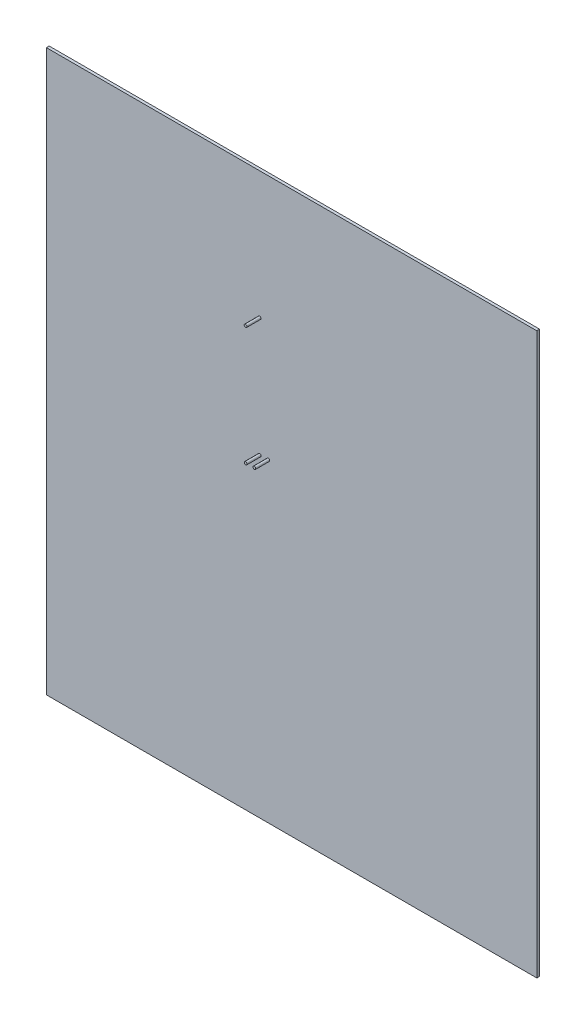
ISO-10303-21;
HEADER;
FILE_DESCRIPTION(('STEP AP214'),'2;1');
FILE_NAME('part.step','',(''),(''),'','','');
FILE_SCHEMA(('AUTOMOTIVE_DESIGN { 1 0 10303 214 1 1 1 1 }'));
ENDSEC;
DATA;
#1=APPLICATION_CONTEXT('core data for automotive mechanical design processes');
#2=APPLICATION_PROTOCOL_DEFINITION('international standard','automotive_design',2000,#1);
#3=PRODUCT_CONTEXT('',#1,'mechanical');
#4=PRODUCT('Part','Part','',(#3));
#5=PRODUCT_RELATED_PRODUCT_CATEGORY('part','',(#4));
#6=PRODUCT_DEFINITION_FORMATION('','',#4);
#7=PRODUCT_DEFINITION_CONTEXT('part definition',#1,'design');
#8=PRODUCT_DEFINITION('design','',#6,#7);
#9=PRODUCT_DEFINITION_SHAPE('','',#8);
#10=(LENGTH_UNIT() NAMED_UNIT(*) SI_UNIT(.MILLI.,.METRE.));
#11=(NAMED_UNIT(*) PLANE_ANGLE_UNIT() SI_UNIT($,.RADIAN.));
#12=(NAMED_UNIT(*) SI_UNIT($,.STERADIAN.) SOLID_ANGLE_UNIT());
#13=UNCERTAINTY_MEASURE_WITH_UNIT(LENGTH_MEASURE(1.E-05),#10,'distance_accuracy_value','');
#14=(GEOMETRIC_REPRESENTATION_CONTEXT(3) GLOBAL_UNCERTAINTY_ASSIGNED_CONTEXT((#13)) GLOBAL_UNIT_ASSIGNED_CONTEXT((#10,
#11,#12)) REPRESENTATION_CONTEXT('',''));
#15=CARTESIAN_POINT('',(0.,0.,0.));
#16=DIRECTION('',(0.,0.,1.));
#17=DIRECTION('',(1.,0.,0.));
#18=AXIS2_PLACEMENT_3D('',#15,#16,#17);
#19=CARTESIAN_POINT('',(175.,-200.,2.));
#20=DIRECTION('',(-1.,0.,0.));
#21=DIRECTION('',(0.,0.,1.));
#22=AXIS2_PLACEMENT_3D('',#19,#20,#21);
#23=PLANE('',#22);
#24=DIRECTION('',(0.,1.,0.));
#25=VECTOR('',#24,1.);
#26=CARTESIAN_POINT('',(175.,-200.,0.));
#27=LINE('',#26,#25);
#28=CARTESIAN_POINT('',(175.,-200.,0.));
#29=VERTEX_POINT('',#28);
#30=CARTESIAN_POINT('',(175.,200.,0.));
#31=VERTEX_POINT('',#30);
#32=EDGE_CURVE('E108',#29,#31,#27,.T.);
#33=ORIENTED_EDGE('',*,*,#32,.T.);
#34=DIRECTION('',(0.,0.,-1.));
#35=VECTOR('',#34,1.);
#36=CARTESIAN_POINT('',(175.,200.,2.));
#37=LINE('',#36,#35);
#38=CARTESIAN_POINT('',(175.,200.,2.));
#39=VERTEX_POINT('',#38);
#40=EDGE_CURVE('E99',#39,#31,#37,.T.);
#41=ORIENTED_EDGE('',*,*,#40,.F.);
#42=DIRECTION('',(0.,1.,0.));
#43=VECTOR('',#42,1.);
#44=CARTESIAN_POINT('',(175.,-200.,2.));
#45=LINE('',#44,#43);
#46=CARTESIAN_POINT('',(175.,-200.,2.));
#47=VERTEX_POINT('',#46);
#48=EDGE_CURVE('E93',#47,#39,#45,.T.);
#49=ORIENTED_EDGE('',*,*,#48,.F.);
#50=DIRECTION('',(0.,0.,-1.));
#51=VECTOR('',#50,1.);
#52=CARTESIAN_POINT('',(175.,-200.,2.));
#53=LINE('',#52,#51);
#54=EDGE_CURVE('E104',#47,#29,#53,.T.);
#55=ORIENTED_EDGE('',*,*,#54,.T.);
#56=EDGE_LOOP('',(#33,#41,#49,#55));
#57=FACE_BOUND('',#56,.T.);
#58=ADVANCED_FACE('F41',(#57),#23,.F.);
#59=CARTESIAN_POINT('',(-175.,200.,2.));
#60=DIRECTION('',(0.,-1.,0.));
#61=DIRECTION('',(0.,0.,-1.));
#62=AXIS2_PLACEMENT_3D('',#59,#60,#61);
#63=PLANE('',#62);
#64=DIRECTION('',(-1.,0.,0.));
#65=VECTOR('',#64,1.);
#66=CARTESIAN_POINT('',(-175.,200.,0.));
#67=LINE('',#66,#65);
#68=CARTESIAN_POINT('',(-175.,200.,0.));
#69=VERTEX_POINT('',#68);
#70=EDGE_CURVE('E98',#31,#69,#67,.T.);
#71=ORIENTED_EDGE('',*,*,#70,.T.);
#72=DIRECTION('',(0.,0.,-1.));
#73=VECTOR('',#72,1.);
#74=CARTESIAN_POINT('',(-175.,200.,2.));
#75=LINE('',#74,#73);
#76=CARTESIAN_POINT('',(-175.,200.,2.));
#77=VERTEX_POINT('',#76);
#78=EDGE_CURVE('E96',#77,#69,#75,.T.);
#79=ORIENTED_EDGE('',*,*,#78,.F.);
#80=DIRECTION('',(-1.,0.,0.));
#81=VECTOR('',#80,1.);
#82=CARTESIAN_POINT('',(-175.,200.,2.));
#83=LINE('',#82,#81);
#84=EDGE_CURVE('E88',#39,#77,#83,.T.);
#85=ORIENTED_EDGE('',*,*,#84,.F.);
#86=ORIENTED_EDGE('',*,*,#40,.T.);
#87=EDGE_LOOP('',(#71,#79,#85,#86));
#88=FACE_BOUND('',#87,.T.);
#89=ADVANCED_FACE('F97',(#88),#63,.F.);
#90=CARTESIAN_POINT('',(-175.,-200.,2.));
#91=DIRECTION('',(1.,0.,0.));
#92=DIRECTION('',(0.,0.,-1.));
#93=AXIS2_PLACEMENT_3D('',#90,#91,#92);
#94=PLANE('',#93);
#95=DIRECTION('',(0.,-1.,0.));
#96=VECTOR('',#95,1.);
#97=CARTESIAN_POINT('',(-175.,-200.,0.));
#98=LINE('',#97,#96);
#99=CARTESIAN_POINT('',(-175.,-200.,0.));
#100=VERTEX_POINT('',#99);
#101=EDGE_CURVE('E74',#69,#100,#98,.T.);
#102=ORIENTED_EDGE('',*,*,#101,.T.);
#103=DIRECTION('',(0.,0.,-1.));
#104=VECTOR('',#103,1.);
#105=CARTESIAN_POINT('',(-175.,-200.,2.));
#106=LINE('',#105,#104);
#107=CARTESIAN_POINT('',(-175.,-200.,2.));
#108=VERTEX_POINT('',#107);
#109=EDGE_CURVE('E100',#108,#100,#106,.T.);
#110=ORIENTED_EDGE('',*,*,#109,.F.);
#111=DIRECTION('',(0.,-1.,0.));
#112=VECTOR('',#111,1.);
#113=CARTESIAN_POINT('',(-175.,-200.,2.));
#114=LINE('',#113,#112);
#115=EDGE_CURVE('E91',#77,#108,#114,.T.);
#116=ORIENTED_EDGE('',*,*,#115,.F.);
#117=ORIENTED_EDGE('',*,*,#78,.T.);
#118=EDGE_LOOP('',(#102,#110,#116,#117));
#119=FACE_BOUND('',#118,.T.);
#120=ADVANCED_FACE('F102',(#119),#94,.F.);
#121=CARTESIAN_POINT('',(-175.,-200.,2.));
#122=DIRECTION('',(0.,1.,0.));
#123=DIRECTION('',(0.,0.,1.));
#124=AXIS2_PLACEMENT_3D('',#121,#122,#123);
#125=PLANE('',#124);
#126=DIRECTION('',(1.,0.,0.));
#127=VECTOR('',#126,1.);
#128=CARTESIAN_POINT('',(-175.,-200.,0.));
#129=LINE('',#128,#127);
#130=EDGE_CURVE('E80',#100,#29,#129,.T.);
#131=ORIENTED_EDGE('',*,*,#130,.T.);
#132=ORIENTED_EDGE('',*,*,#54,.F.);
#133=DIRECTION('',(1.,0.,0.));
#134=VECTOR('',#133,1.);
#135=CARTESIAN_POINT('',(-175.,-200.,2.));
#136=LINE('',#135,#134);
#137=EDGE_CURVE('E57',#108,#47,#136,.T.);
#138=ORIENTED_EDGE('',*,*,#137,.F.);
#139=ORIENTED_EDGE('',*,*,#109,.T.);
#140=EDGE_LOOP('',(#131,#132,#138,#139));
#141=FACE_BOUND('',#140,.T.);
#142=ADVANCED_FACE('F128',(#141),#125,.F.);
#143=CARTESIAN_POINT('',(0.,0.,2.));
#144=DIRECTION('',(0.,0.,-1.));
#145=DIRECTION('',(-1.,0.,0.));
#146=AXIS2_PLACEMENT_3D('',#143,#144,#145);
#147=PLANE('',#146);
#148=CARTESIAN_POINT('',(-22.83,109.16,2.));
#149=DIRECTION('',(0.,0.,-1.));
#150=DIRECTION('',(-1.,0.,0.));
#151=AXIS2_PLACEMENT_3D('',#148,#149,#150);
#152=CIRCLE('',#151,1.);
#153=CARTESIAN_POINT('',(-23.83,109.16,2.));
#154=VERTEX_POINT('',#153);
#155=EDGE_CURVE('E11',#154,#154,#152,.F.);
#156=ORIENTED_EDGE('',*,*,#155,.F.);
#157=EDGE_LOOP('',(#156));
#158=FACE_BOUND('',#157,.T.);
#159=CARTESIAN_POINT('',(-22.7700000000001,24.27,2.));
#160=DIRECTION('',(0.,0.,-1.));
#161=DIRECTION('',(-1.,0.,0.));
#162=AXIS2_PLACEMENT_3D('',#159,#160,#161);
#163=CIRCLE('',#162,1.);
#164=CARTESIAN_POINT('',(-23.7700000000001,24.27,2.));
#165=VERTEX_POINT('',#164);
#166=EDGE_CURVE('E49',#165,#165,#163,.F.);
#167=ORIENTED_EDGE('',*,*,#166,.F.);
#168=EDGE_LOOP('',(#167));
#169=FACE_BOUND('',#168,.T.);
#170=CARTESIAN_POINT('',(-16.6,24.5,2.));
#171=DIRECTION('',(0.,0.,-1.));
#172=DIRECTION('',(-1.,0.,0.));
#173=AXIS2_PLACEMENT_3D('',#170,#171,#172);
#174=CIRCLE('',#173,1.);
#175=CARTESIAN_POINT('',(-17.6,24.5,2.));
#176=VERTEX_POINT('',#175);
#177=EDGE_CURVE('E118',#176,#176,#174,.F.);
#178=ORIENTED_EDGE('',*,*,#177,.F.);
#179=EDGE_LOOP('',(#178));
#180=FACE_BOUND('',#179,.T.);
#181=ORIENTED_EDGE('',*,*,#48,.T.);
#182=ORIENTED_EDGE('',*,*,#84,.T.);
#183=ORIENTED_EDGE('',*,*,#115,.T.);
#184=ORIENTED_EDGE('',*,*,#137,.T.);
#185=EDGE_LOOP('',(#181,#182,#183,#184));
#186=FACE_BOUND('',#185,.T.);
#187=ADVANCED_FACE('F89',(#158,#169,#180,#186),#147,.F.);
#188=CARTESIAN_POINT('',(0.,0.,0.));
#189=DIRECTION('',(0.,0.,-1.));
#190=DIRECTION('',(-1.,0.,0.));
#191=AXIS2_PLACEMENT_3D('',#188,#189,#190);
#192=PLANE('',#191);
#193=ORIENTED_EDGE('',*,*,#32,.F.);
#194=ORIENTED_EDGE('',*,*,#130,.F.);
#195=ORIENTED_EDGE('',*,*,#101,.F.);
#196=ORIENTED_EDGE('',*,*,#70,.F.);
#197=EDGE_LOOP('',(#193,#194,#195,#196));
#198=FACE_BOUND('',#197,.T.);
#199=ADVANCED_FACE('F127',(#198),#192,.T.);
#200=CARTESIAN_POINT('',(-16.6,24.5,12.));
#201=DIRECTION('',(0.,0.,-1.));
#202=DIRECTION('',(-1.,0.,0.));
#203=AXIS2_PLACEMENT_3D('',#200,#201,#202);
#204=CYLINDRICAL_SURFACE('',#203,1.);
#205=CARTESIAN_POINT('',(-16.6,24.5,12.));
#206=DIRECTION('',(0.,0.,1.));
#207=DIRECTION('',(1.,0.,0.));
#208=AXIS2_PLACEMENT_3D('',#205,#206,#207);
#209=CIRCLE('',#208,1.);
#210=CARTESIAN_POINT('',(-15.6,24.5,12.));
#211=VERTEX_POINT('',#210);
#212=EDGE_CURVE('E111',#211,#211,#209,.T.);
#213=ORIENTED_EDGE('',*,*,#212,.F.);
#214=EDGE_LOOP('',(#213));
#215=FACE_BOUND('',#214,.T.);
#216=ORIENTED_EDGE('',*,*,#177,.T.);
#217=EDGE_LOOP('',(#216));
#218=FACE_BOUND('',#217,.T.);
#219=ADVANCED_FACE('F133',(#215,#218),#204,.T.);
#220=CARTESIAN_POINT('',(-16.6,24.5,12.));
#221=DIRECTION('',(0.,0.,1.));
#222=DIRECTION('',(1.,0.,0.));
#223=AXIS2_PLACEMENT_3D('',#220,#221,#222);
#224=PLANE('',#223);
#225=ORIENTED_EDGE('',*,*,#212,.T.);
#226=EDGE_LOOP('',(#225));
#227=FACE_BOUND('',#226,.T.);
#228=ADVANCED_FACE('F135',(#227),#224,.T.);
#229=CARTESIAN_POINT('',(-22.7700000000001,24.27,12.));
#230=DIRECTION('',(0.,0.,-1.));
#231=DIRECTION('',(-1.,0.,0.));
#232=AXIS2_PLACEMENT_3D('',#229,#230,#231);
#233=CYLINDRICAL_SURFACE('',#232,1.);
#234=CARTESIAN_POINT('',(-22.7700000000001,24.27,12.));
#235=DIRECTION('',(0.,0.,1.));
#236=DIRECTION('',(1.,0.,0.));
#237=AXIS2_PLACEMENT_3D('',#234,#235,#236);
#238=CIRCLE('',#237,1.);
#239=CARTESIAN_POINT('',(-21.7700000000001,24.27,12.));
#240=VERTEX_POINT('',#239);
#241=EDGE_CURVE('E267',#240,#240,#238,.T.);
#242=ORIENTED_EDGE('',*,*,#241,.F.);
#243=EDGE_LOOP('',(#242));
#244=FACE_BOUND('',#243,.T.);
#245=ORIENTED_EDGE('',*,*,#166,.T.);
#246=EDGE_LOOP('',(#245));
#247=FACE_BOUND('',#246,.T.);
#248=ADVANCED_FACE('F123',(#244,#247),#233,.T.);
#249=CARTESIAN_POINT('',(-22.7700000000001,24.27,12.));
#250=DIRECTION('',(0.,0.,1.));
#251=DIRECTION('',(1.,0.,0.));
#252=AXIS2_PLACEMENT_3D('',#249,#250,#251);
#253=PLANE('',#252);
#254=ORIENTED_EDGE('',*,*,#241,.T.);
#255=EDGE_LOOP('',(#254));
#256=FACE_BOUND('',#255,.T.);
#257=ADVANCED_FACE('F214',(#256),#253,.T.);
#258=CARTESIAN_POINT('',(-22.83,109.16,12.));
#259=DIRECTION('',(0.,0.,-1.));
#260=DIRECTION('',(-1.,0.,0.));
#261=AXIS2_PLACEMENT_3D('',#258,#259,#260);
#262=CYLINDRICAL_SURFACE('',#261,1.);
#263=CARTESIAN_POINT('',(-22.83,109.16,12.));
#264=DIRECTION('',(0.,0.,1.));
#265=DIRECTION('',(1.,0.,0.));
#266=AXIS2_PLACEMENT_3D('',#263,#264,#265);
#267=CIRCLE('',#266,1.);
#268=CARTESIAN_POINT('',(-21.83,109.16,12.));
#269=VERTEX_POINT('',#268);
#270=EDGE_CURVE('E266',#269,#269,#267,.T.);
#271=ORIENTED_EDGE('',*,*,#270,.F.);
#272=EDGE_LOOP('',(#271));
#273=FACE_BOUND('',#272,.T.);
#274=ORIENTED_EDGE('',*,*,#155,.T.);
#275=EDGE_LOOP('',(#274));
#276=FACE_BOUND('',#275,.T.);
#277=ADVANCED_FACE('F224',(#273,#276),#262,.T.);
#278=CARTESIAN_POINT('',(-22.83,109.16,12.));
#279=DIRECTION('',(0.,0.,1.));
#280=DIRECTION('',(1.,0.,0.));
#281=AXIS2_PLACEMENT_3D('',#278,#279,#280);
#282=PLANE('',#281);
#283=ORIENTED_EDGE('',*,*,#270,.T.);
#284=EDGE_LOOP('',(#283));
#285=FACE_BOUND('',#284,.T.);
#286=ADVANCED_FACE('F234',(#285),#282,.T.);
#287=CLOSED_SHELL('',(#58,#89,#120,#142,#187,#199,#219,#228,#248,#257,#277,#286));
#288=MANIFOLD_SOLID_BREP('B2',#287);
#289=ADVANCED_BREP_SHAPE_REPRESENTATION('',(#18,#288),#14);
#290=SHAPE_DEFINITION_REPRESENTATION(#9,#289);
ENDSEC;
END-ISO-10303-21;
